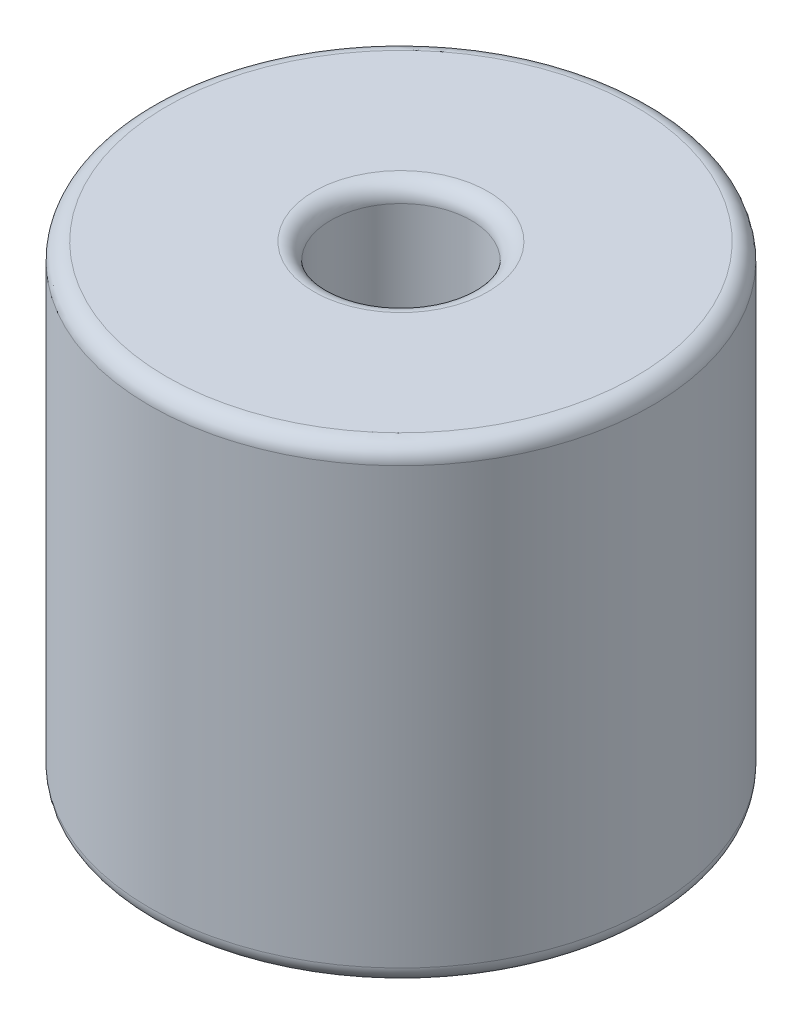
ISO-10303-21;
HEADER;
FILE_DESCRIPTION(('STEP AP214'),'2;1');
FILE_NAME('part.step','',(''),(''),'','','');
FILE_SCHEMA(('AUTOMOTIVE_DESIGN { 1 0 10303 214 1 1 1 1 }'));
ENDSEC;
DATA;
#1=APPLICATION_CONTEXT('core data for automotive mechanical design processes');
#2=APPLICATION_PROTOCOL_DEFINITION('international standard','automotive_design',2000,#1);
#3=PRODUCT_CONTEXT('',#1,'mechanical');
#4=PRODUCT('Part','Part','',(#3));
#5=PRODUCT_RELATED_PRODUCT_CATEGORY('part','',(#4));
#6=PRODUCT_DEFINITION_FORMATION('','',#4);
#7=PRODUCT_DEFINITION_CONTEXT('part definition',#1,'design');
#8=PRODUCT_DEFINITION('design','',#6,#7);
#9=PRODUCT_DEFINITION_SHAPE('','',#8);
#10=(LENGTH_UNIT() NAMED_UNIT(*) SI_UNIT(.MILLI.,.METRE.));
#11=(NAMED_UNIT(*) PLANE_ANGLE_UNIT() SI_UNIT($,.RADIAN.));
#12=(NAMED_UNIT(*) SI_UNIT($,.STERADIAN.) SOLID_ANGLE_UNIT());
#13=UNCERTAINTY_MEASURE_WITH_UNIT(LENGTH_MEASURE(1.E-05),#10,'distance_accuracy_value','');
#14=(GEOMETRIC_REPRESENTATION_CONTEXT(3) GLOBAL_UNCERTAINTY_ASSIGNED_CONTEXT((#13)) GLOBAL_UNIT_ASSIGNED_CONTEXT((#10,
#11,#12)) REPRESENTATION_CONTEXT('',''));
#15=CARTESIAN_POINT('',(0.,0.,0.));
#16=DIRECTION('',(0.,0.,1.));
#17=DIRECTION('',(1.,0.,0.));
#18=AXIS2_PLACEMENT_3D('',#15,#16,#17);
#19=CARTESIAN_POINT('',(0.,14.,0.));
#20=DIRECTION('',(0.,1.,0.));
#21=DIRECTION('',(0.,0.,1.));
#22=AXIS2_PLACEMENT_3D('',#19,#20,#21);
#23=PLANE('',#22);
#24=CARTESIAN_POINT('',(0.,14.,0.));
#25=DIRECTION('',(0.,1.,0.));
#26=DIRECTION('',(0.,0.,1.));
#27=AXIS2_PLACEMENT_3D('',#24,#25,#26);
#28=CIRCLE('',#27,2.6);
#29=CARTESIAN_POINT('',(0.,14.,2.6));
#30=VERTEX_POINT('',#29);
#31=EDGE_CURVE('E42',#30,#30,#28,.F.);
#32=ORIENTED_EDGE('',*,*,#31,.T.);
#33=EDGE_LOOP('',(#32));
#34=FACE_BOUND('',#33,.T.);
#35=CARTESIAN_POINT('',(0.,14.,0.));
#36=DIRECTION('',(0.,1.,0.));
#37=DIRECTION('',(0.,0.,1.));
#38=AXIS2_PLACEMENT_3D('',#35,#36,#37);
#39=CIRCLE('',#38,7.);
#40=CARTESIAN_POINT('',(0.,14.,7.));
#41=VERTEX_POINT('',#40);
#42=EDGE_CURVE('E46',#41,#41,#39,.T.);
#43=ORIENTED_EDGE('',*,*,#42,.T.);
#44=EDGE_LOOP('',(#43));
#45=FACE_BOUND('',#44,.T.);
#46=ADVANCED_FACE('F31',(#34,#45),#23,.T.);
#47=CARTESIAN_POINT('',(0.,0.,0.));
#48=DIRECTION('',(0.,1.,0.));
#49=DIRECTION('',(0.,0.,1.));
#50=AXIS2_PLACEMENT_3D('',#47,#48,#49);
#51=PLANE('',#50);
#52=CARTESIAN_POINT('',(0.,0.,0.));
#53=DIRECTION('',(0.,1.,0.));
#54=DIRECTION('',(0.,0.,1.));
#55=AXIS2_PLACEMENT_3D('',#52,#53,#54);
#56=CIRCLE('',#55,2.6);
#57=CARTESIAN_POINT('',(0.,0.,2.6));
#58=VERTEX_POINT('',#57);
#59=EDGE_CURVE('E57',#58,#58,#56,.T.);
#60=ORIENTED_EDGE('',*,*,#59,.T.);
#61=EDGE_LOOP('',(#60));
#62=FACE_BOUND('',#61,.T.);
#63=CARTESIAN_POINT('',(0.,0.,0.));
#64=DIRECTION('',(0.,1.,0.));
#65=DIRECTION('',(0.,0.,1.));
#66=AXIS2_PLACEMENT_3D('',#63,#64,#65);
#67=CIRCLE('',#66,7.);
#68=CARTESIAN_POINT('',(0.,0.,7.));
#69=VERTEX_POINT('',#68);
#70=EDGE_CURVE('E60',#69,#69,#67,.F.);
#71=ORIENTED_EDGE('',*,*,#70,.T.);
#72=EDGE_LOOP('',(#71));
#73=FACE_BOUND('',#72,.T.);
#74=ADVANCED_FACE('F64',(#62,#73),#51,.F.);
#75=CARTESIAN_POINT('',(0.,14.,0.));
#76=DIRECTION('',(0.,-1.,0.));
#77=DIRECTION('',(0.,0.,-1.));
#78=AXIS2_PLACEMENT_3D('',#75,#76,#77);
#79=CYLINDRICAL_SURFACE('',#78,7.5);
#80=CARTESIAN_POINT('',(0.,0.5,0.));
#81=DIRECTION('',(0.,1.,0.));
#82=DIRECTION('',(0.,0.,1.));
#83=AXIS2_PLACEMENT_3D('',#80,#81,#82);
#84=CIRCLE('',#83,7.5);
#85=CARTESIAN_POINT('',(0.,0.5,7.5));
#86=VERTEX_POINT('',#85);
#87=EDGE_CURVE('E10',#86,#86,#84,.T.);
#88=ORIENTED_EDGE('',*,*,#87,.T.);
#89=EDGE_LOOP('',(#88));
#90=FACE_BOUND('',#89,.T.);
#91=CARTESIAN_POINT('',(0.,13.5,0.));
#92=DIRECTION('',(0.,1.,0.));
#93=DIRECTION('',(0.,0.,1.));
#94=AXIS2_PLACEMENT_3D('',#91,#92,#93);
#95=CIRCLE('',#94,7.5);
#96=CARTESIAN_POINT('',(0.,13.5,7.5));
#97=VERTEX_POINT('',#96);
#98=EDGE_CURVE('E38',#97,#97,#95,.F.);
#99=ORIENTED_EDGE('',*,*,#98,.T.);
#100=EDGE_LOOP('',(#99));
#101=FACE_BOUND('',#100,.T.);
#102=ADVANCED_FACE('F84',(#90,#101),#79,.T.);
#103=CARTESIAN_POINT('',(0.,14.,0.));
#104=DIRECTION('',(0.,-1.,0.));
#105=DIRECTION('',(0.,0.,-1.));
#106=AXIS2_PLACEMENT_3D('',#103,#104,#105);
#107=CYLINDRICAL_SURFACE('',#106,2.1);
#108=CARTESIAN_POINT('',(0.,0.5,0.));
#109=DIRECTION('',(0.,1.,0.));
#110=DIRECTION('',(0.,0.,1.));
#111=AXIS2_PLACEMENT_3D('',#108,#109,#110);
#112=CIRCLE('',#111,2.1);
#113=CARTESIAN_POINT('',(0.,0.5,2.1));
#114=VERTEX_POINT('',#113);
#115=EDGE_CURVE('E51',#114,#114,#112,.F.);
#116=ORIENTED_EDGE('',*,*,#115,.T.);
#117=EDGE_LOOP('',(#116));
#118=FACE_BOUND('',#117,.T.);
#119=CARTESIAN_POINT('',(0.,13.5,0.));
#120=DIRECTION('',(0.,1.,0.));
#121=DIRECTION('',(0.,0.,1.));
#122=AXIS2_PLACEMENT_3D('',#119,#120,#121);
#123=CIRCLE('',#122,2.1);
#124=CARTESIAN_POINT('',(0.,13.5,2.1));
#125=VERTEX_POINT('',#124);
#126=EDGE_CURVE('E54',#125,#125,#123,.T.);
#127=ORIENTED_EDGE('',*,*,#126,.T.);
#128=EDGE_LOOP('',(#127));
#129=FACE_BOUND('',#128,.T.);
#130=ADVANCED_FACE('F89',(#118,#129),#107,.F.);
#131=CARTESIAN_POINT('',(0.,0.5,0.));
#132=DIRECTION('',(0.,1.,0.));
#133=DIRECTION('',(0.,0.,1.));
#134=AXIS2_PLACEMENT_3D('',#131,#132,#133);
#135=TOROIDAL_SURFACE('',#134,2.6,0.5);
#136=ORIENTED_EDGE('',*,*,#115,.F.);
#137=EDGE_LOOP('',(#136));
#138=FACE_BOUND('',#137,.T.);
#139=ORIENTED_EDGE('',*,*,#59,.F.);
#140=EDGE_LOOP('',(#139));
#141=FACE_BOUND('',#140,.T.);
#142=ADVANCED_FACE('F75',(#138,#141),#135,.T.);
#143=CARTESIAN_POINT('',(0.,13.5,0.));
#144=DIRECTION('',(0.,1.,0.));
#145=DIRECTION('',(0.,0.,1.));
#146=AXIS2_PLACEMENT_3D('',#143,#144,#145);
#147=TOROIDAL_SURFACE('',#146,2.6,0.5);
#148=ORIENTED_EDGE('',*,*,#31,.F.);
#149=EDGE_LOOP('',(#148));
#150=FACE_BOUND('',#149,.T.);
#151=ORIENTED_EDGE('',*,*,#126,.F.);
#152=EDGE_LOOP('',(#151));
#153=FACE_BOUND('',#152,.T.);
#154=ADVANCED_FACE('F69',(#150,#153),#147,.T.);
#155=CARTESIAN_POINT('',(0.,0.5,0.));
#156=DIRECTION('',(0.,1.,0.));
#157=DIRECTION('',(0.,0.,1.));
#158=AXIS2_PLACEMENT_3D('',#155,#156,#157);
#159=TOROIDAL_SURFACE('',#158,7.,0.5);
#160=ORIENTED_EDGE('',*,*,#70,.F.);
#161=EDGE_LOOP('',(#160));
#162=FACE_BOUND('',#161,.T.);
#163=ORIENTED_EDGE('',*,*,#87,.F.);
#164=EDGE_LOOP('',(#163));
#165=FACE_BOUND('',#164,.T.);
#166=ADVANCED_FACE('F66',(#162,#165),#159,.T.);
#167=CARTESIAN_POINT('',(0.,13.5,0.));
#168=DIRECTION('',(0.,1.,0.));
#169=DIRECTION('',(0.,0.,1.));
#170=AXIS2_PLACEMENT_3D('',#167,#168,#169);
#171=TOROIDAL_SURFACE('',#170,7.,0.5);
#172=ORIENTED_EDGE('',*,*,#98,.F.);
#173=EDGE_LOOP('',(#172));
#174=FACE_BOUND('',#173,.T.);
#175=ORIENTED_EDGE('',*,*,#42,.F.);
#176=EDGE_LOOP('',(#175));
#177=FACE_BOUND('',#176,.T.);
#178=ADVANCED_FACE('F33',(#174,#177),#171,.T.);
#179=CLOSED_SHELL('',(#46,#74,#102,#130,#142,#154,#166,#178));
#180=MANIFOLD_SOLID_BREP('B2',#179);
#181=ADVANCED_BREP_SHAPE_REPRESENTATION('',(#18,#180),#14);
#182=SHAPE_DEFINITION_REPRESENTATION(#9,#181);
ENDSEC;
END-ISO-10303-21;
